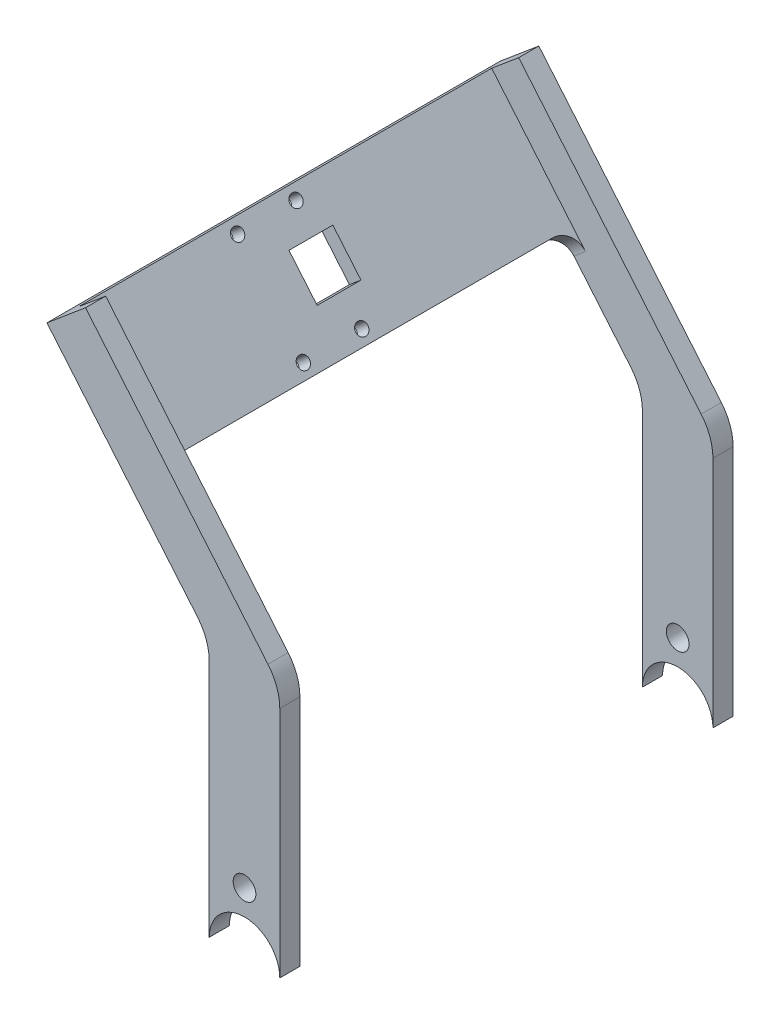
ISO-10303-21;
HEADER;
FILE_DESCRIPTION(('STEP AP214'),'2;1');
FILE_NAME('part.step','',(''),(''),'','','');
FILE_SCHEMA(('AUTOMOTIVE_DESIGN { 1 0 10303 214 1 1 1 1 }'));
ENDSEC;
DATA;
#1=APPLICATION_CONTEXT('core data for automotive mechanical design processes');
#2=APPLICATION_PROTOCOL_DEFINITION('international standard','automotive_design',2000,#1);
#3=PRODUCT_CONTEXT('',#1,'mechanical');
#4=PRODUCT('Part','Part','',(#3));
#5=PRODUCT_RELATED_PRODUCT_CATEGORY('part','',(#4));
#6=PRODUCT_DEFINITION_FORMATION('','',#4);
#7=PRODUCT_DEFINITION_CONTEXT('part definition',#1,'design');
#8=PRODUCT_DEFINITION('design','',#6,#7);
#9=PRODUCT_DEFINITION_SHAPE('','',#8);
#10=(LENGTH_UNIT() NAMED_UNIT(*) SI_UNIT(.MILLI.,.METRE.));
#11=(NAMED_UNIT(*) PLANE_ANGLE_UNIT() SI_UNIT($,.RADIAN.));
#12=(NAMED_UNIT(*) SI_UNIT($,.STERADIAN.) SOLID_ANGLE_UNIT());
#13=UNCERTAINTY_MEASURE_WITH_UNIT(LENGTH_MEASURE(1.E-05),#10,'distance_accuracy_value','');
#14=(GEOMETRIC_REPRESENTATION_CONTEXT(3) GLOBAL_UNCERTAINTY_ASSIGNED_CONTEXT((#13)) GLOBAL_UNIT_ASSIGNED_CONTEXT((#10,
#11,#12)) REPRESENTATION_CONTEXT('',''));
#15=CARTESIAN_POINT('',(0.,0.,0.));
#16=DIRECTION('',(0.,0.,1.));
#17=DIRECTION('',(1.,0.,0.));
#18=AXIS2_PLACEMENT_3D('',#15,#16,#17);
#19=CARTESIAN_POINT('',(7.00000000000001,50.,4.));
#20=DIRECTION('',(-1.,0.,0.));
#21=DIRECTION('',(0.,-1.,0.));
#22=AXIS2_PLACEMENT_3D('',#19,#20,#21);
#23=PLANE('',#22);
#24=DIRECTION('',(0.,1.,0.));
#25=VECTOR('',#24,1.);
#26=CARTESIAN_POINT('',(7.00000000000001,50.,0.));
#27=LINE('',#26,#25);
#28=CARTESIAN_POINT('',(6.99999999999999,0.,0.));
#29=VERTEX_POINT('',#28);
#30=CARTESIAN_POINT('',(7.00000000000001,46.360297657338,0.));
#31=VERTEX_POINT('',#30);
#32=EDGE_CURVE('E318',#29,#31,#27,.T.);
#33=ORIENTED_EDGE('',*,*,#32,.T.);
#34=DIRECTION('',(0.,0.,-1.));
#35=VECTOR('',#34,1.);
#36=CARTESIAN_POINT('',(7.00000000000001,46.360297657338,4.));
#37=LINE('',#36,#35);
#38=CARTESIAN_POINT('',(7.00000000000001,46.360297657338,4.));
#39=VERTEX_POINT('',#38);
#40=EDGE_CURVE('E379',#31,#39,#37,.F.);
#41=ORIENTED_EDGE('',*,*,#40,.T.);
#42=DIRECTION('',(0.,1.,0.));
#43=VECTOR('',#42,1.);
#44=CARTESIAN_POINT('',(7.00000000000001,50.,4.));
#45=LINE('',#44,#43);
#46=CARTESIAN_POINT('',(6.99999999999999,0.,4.));
#47=VERTEX_POINT('',#46);
#48=EDGE_CURVE('E323',#47,#39,#45,.T.);
#49=ORIENTED_EDGE('',*,*,#48,.F.);
#50=DIRECTION('',(0.,0.,-1.));
#51=VECTOR('',#50,1.);
#52=CARTESIAN_POINT('',(6.99999999999999,0.,4.));
#53=LINE('',#52,#51);
#54=EDGE_CURVE('E338',#47,#29,#53,.T.);
#55=ORIENTED_EDGE('',*,*,#54,.T.);
#56=EDGE_LOOP('',(#33,#41,#49,#55));
#57=FACE_BOUND('',#56,.T.);
#58=ADVANCED_FACE('F37',(#57),#23,.F.);
#59=CARTESIAN_POINT('',(-31.5672565811925,95.9626665871386,4.));
#60=DIRECTION('',(-0.766044443118976,-0.642787609686541,0.));
#61=DIRECTION('',(0.642787609686541,-0.766044443118976,0.));
#62=AXIS2_PLACEMENT_3D('',#59,#60,#61);
#63=PLANE('',#62);
#64=DIRECTION('',(-0.642787609686541,0.766044443118976,0.));
#65=VECTOR('',#64,1.);
#66=CARTESIAN_POINT('',(-31.5672565811925,95.9626665871386,4.));
#67=LINE('',#66,#65);
#68=CARTESIAN_POINT('',(4.66044443118977,52.7881737542034,4.));
#69=VERTEX_POINT('',#68);
#70=CARTESIAN_POINT('',(-31.5672565811925,95.9626665871386,4.));
#71=VERTEX_POINT('',#70);
#72=EDGE_CURVE('E326',#69,#71,#67,.T.);
#73=ORIENTED_EDGE('',*,*,#72,.F.);
#74=DIRECTION('',(0.,0.,-1.));
#75=VECTOR('',#74,1.);
#76=CARTESIAN_POINT('',(4.66044443118978,52.7881737542034,4.));
#77=LINE('',#76,#75);
#78=CARTESIAN_POINT('',(4.66044443118977,52.7881737542034,0.));
#79=VERTEX_POINT('',#78);
#80=EDGE_CURVE('E374',#69,#79,#77,.T.);
#81=ORIENTED_EDGE('',*,*,#80,.T.);
#82=DIRECTION('',(-0.642787609686541,0.766044443118976,0.));
#83=VECTOR('',#82,1.);
#84=CARTESIAN_POINT('',(-31.5672565811925,95.9626665871386,0.));
#85=LINE('',#84,#83);
#86=CARTESIAN_POINT('',(-31.5672565811925,95.9626665871386,0.));
#87=VERTEX_POINT('',#86);
#88=EDGE_CURVE('E341',#79,#87,#85,.T.);
#89=ORIENTED_EDGE('',*,*,#88,.T.);
#90=DIRECTION('',(0.,0.,-1.));
#91=VECTOR('',#90,1.);
#92=CARTESIAN_POINT('',(-31.5672565811925,95.9626665871386,4.));
#93=LINE('',#92,#91);
#94=EDGE_CURVE('E359',#71,#87,#93,.T.);
#95=ORIENTED_EDGE('',*,*,#94,.F.);
#96=EDGE_LOOP('',(#73,#81,#89,#95));
#97=FACE_BOUND('',#96,.T.);
#98=ADVANCED_FACE('F486',(#97),#63,.F.);
#99=CARTESIAN_POINT('',(-39.2277010123822,89.5347904902732,4.));
#100=DIRECTION('',(0.642787609686541,-0.766044443118976,0.));
#101=DIRECTION('',(0.766044443118976,0.642787609686541,0.));
#102=AXIS2_PLACEMENT_3D('',#99,#100,#101);
#103=PLANE('',#102);
#104=DIRECTION('',(-0.766044443118976,-0.642787609686541,0.));
#105=VECTOR('',#104,1.);
#106=CARTESIAN_POINT('',(-39.2277010123822,89.5347904902732,0.));
#107=LINE('',#106,#105);
#108=CARTESIAN_POINT('',(-36.9295676830253,91.4631533193328,0.));
#109=VERTEX_POINT('',#108);
#110=EDGE_CURVE('E343',#87,#109,#107,.T.);
#111=ORIENTED_EDGE('',*,*,#110,.T.);
#112=DIRECTION('',(0.,0.,1.));
#113=VECTOR('',#112,1.);
#114=CARTESIAN_POINT('',(-36.9295676830253,91.4631533193328,-82.));
#115=LINE('',#114,#113);
#116=CARTESIAN_POINT('',(-36.9295676830253,91.4631533193328,-82.));
#117=VERTEX_POINT('',#116);
#118=EDGE_CURVE('E312',#117,#109,#115,.T.);
#119=ORIENTED_EDGE('',*,*,#118,.F.);
#120=DIRECTION('',(0.766044443118976,0.642787609686541,0.));
#121=VECTOR('',#120,1.);
#122=CARTESIAN_POINT('',(-31.5672565811925,95.9626665871386,-82.));
#123=LINE('',#122,#121);
#124=CARTESIAN_POINT('',(-31.5672565811925,95.9626665871386,-82.));
#125=VERTEX_POINT('',#124);
#126=EDGE_CURVE('E296',#117,#125,#123,.T.);
#127=ORIENTED_EDGE('',*,*,#126,.T.);
#128=DIRECTION('',(0.,0.,1.));
#129=VECTOR('',#128,1.);
#130=CARTESIAN_POINT('',(-31.5672565811925,95.9626665871386,-86.));
#131=LINE('',#130,#129);
#132=CARTESIAN_POINT('',(-31.5672565811925,95.9626665871386,-86.));
#133=VERTEX_POINT('',#132);
#134=EDGE_CURVE('E304',#133,#125,#131,.T.);
#135=ORIENTED_EDGE('',*,*,#134,.F.);
#136=DIRECTION('',(0.766044443118976,0.642787609686541,0.));
#137=VECTOR('',#136,1.);
#138=CARTESIAN_POINT('',(-31.5672565811925,95.9626665871386,-86.));
#139=LINE('',#138,#137);
#140=CARTESIAN_POINT('',(-39.2277010123822,89.5347904902732,-86.));
#141=VERTEX_POINT('',#140);
#142=EDGE_CURVE('E281',#141,#133,#139,.T.);
#143=ORIENTED_EDGE('',*,*,#142,.F.);
#144=DIRECTION('',(0.,0.,-1.));
#145=VECTOR('',#144,1.);
#146=CARTESIAN_POINT('',(-39.2277010123822,89.5347904902732,4.));
#147=LINE('',#146,#145);
#148=CARTESIAN_POINT('',(-39.2277010123822,89.5347904902732,4.));
#149=VERTEX_POINT('',#148);
#150=EDGE_CURVE('E356',#149,#141,#147,.T.);
#151=ORIENTED_EDGE('',*,*,#150,.F.);
#152=DIRECTION('',(-0.766044443118976,-0.642787609686541,0.));
#153=VECTOR('',#152,1.);
#154=CARTESIAN_POINT('',(-39.2277010123822,89.5347904902732,4.));
#155=LINE('',#154,#153);
#156=EDGE_CURVE('E329',#71,#149,#155,.T.);
#157=ORIENTED_EDGE('',*,*,#156,.F.);
#158=ORIENTED_EDGE('',*,*,#94,.T.);
#159=EDGE_LOOP('',(#111,#119,#127,#135,#143,#151,#157,#158));
#160=FACE_BOUND('',#159,.T.);
#161=ADVANCED_FACE('F449',(#160),#103,.F.);
#162=CARTESIAN_POINT('',(-7.00000000000001,51.1273120277148,4.));
#163=DIRECTION('',(0.766044443118977,0.642787609686541,0.));
#164=DIRECTION('',(-0.642787609686541,0.766044443118977,0.));
#165=AXIS2_PLACEMENT_3D('',#162,#163,#164);
#166=PLANE('',#165);
#167=CARTESIAN_POINT('',(-37.7171501296189,87.7345860489436,-41.65));
#168=DIRECTION('',(0.766044443118977,0.642787609686541,0.));
#169=DIRECTION('',(-0.642787609686541,0.766044443118977,0.));
#170=AXIS2_PLACEMENT_3D('',#167,#168,#169);
#171=CIRCLE('',#170,1.2);
#172=CARTESIAN_POINT('',(-38.4884952612427,88.6538393806864,-41.65));
#173=VERTEX_POINT('',#172);
#174=EDGE_CURVE('E258',#173,#173,#171,.T.);
#175=ORIENTED_EDGE('',*,*,#174,.T.);
#176=EDGE_LOOP('',(#175));
#177=FACE_BOUND('',#176,.T.);
#178=CARTESIAN_POINT('',(-24.6685616529821,72.1838838536284,-30.05));
#179=DIRECTION('',(0.766044443118977,0.642787609686541,0.));
#180=DIRECTION('',(-0.642787609686541,0.766044443118977,0.));
#181=AXIS2_PLACEMENT_3D('',#178,#179,#180);
#182=CIRCLE('',#181,1.2);
#183=CARTESIAN_POINT('',(-25.4399067846059,73.1031371853712,-30.05));
#184=VERTEX_POINT('',#183);
#185=EDGE_CURVE('E255',#184,#184,#182,.T.);
#186=ORIENTED_EDGE('',*,*,#185,.T.);
#187=EDGE_LOOP('',(#186));
#188=FACE_BOUND('',#187,.T.);
#189=DIRECTION('',(0.,0.,1.));
#190=VECTOR('',#189,1.);
#191=CARTESIAN_POINT('',(-34.1175395153742,83.4447371674773,4.00000000000007));
#192=LINE('',#191,#190);
#193=CARTESIAN_POINT('',(-34.1175395153743,83.4447371674774,-45.35));
#194=VERTEX_POINT('',#193);
#195=CARTESIAN_POINT('',(-34.1175395153743,83.4447371674773,-36.65));
#196=VERTEX_POINT('',#195);
#197=EDGE_CURVE('E252',#194,#196,#192,.T.);
#198=ORIENTED_EDGE('',*,*,#197,.T.);
#199=DIRECTION('',(0.642787609686541,-0.766044443118977,0.));
#200=VECTOR('',#199,1.);
#201=CARTESIAN_POINT('',(-7.00000000000001,51.1273120277148,-36.65));
#202=LINE('',#201,#200);
#203=CARTESIAN_POINT('',(-28.5252873111013,76.7801505123422,-36.65));
#204=VERTEX_POINT('',#203);
#205=EDGE_CURVE('E204',#196,#204,#202,.T.);
#206=ORIENTED_EDGE('',*,*,#205,.T.);
#207=DIRECTION('',(0.,0.,-1.));
#208=VECTOR('',#207,1.);
#209=CARTESIAN_POINT('',(-28.5252873111013,76.7801505123422,4.00000000000006));
#210=LINE('',#209,#208);
#211=CARTESIAN_POINT('',(-28.5252873111013,76.7801505123422,-45.35));
#212=VERTEX_POINT('',#211);
#213=EDGE_CURVE('E246',#204,#212,#210,.T.);
#214=ORIENTED_EDGE('',*,*,#213,.T.);
#215=DIRECTION('',(-0.642787609686541,0.766044443118977,0.));
#216=VECTOR('',#215,1.);
#217=CARTESIAN_POINT('',(-6.99999999999999,51.1273120277148,-45.35));
#218=LINE('',#217,#216);
#219=EDGE_CURVE('E249',#212,#194,#218,.T.);
#220=ORIENTED_EDGE('',*,*,#219,.T.);
#221=EDGE_LOOP('',(#198,#206,#214,#220));
#222=FACE_BOUND('',#221,.T.);
#223=CARTESIAN_POINT('',(-24.6685616529821,72.1838838536284,-41.65));
#224=DIRECTION('',(0.766044443118977,0.642787609686541,0.));
#225=DIRECTION('',(-0.642787609686541,0.766044443118977,0.));
#226=AXIS2_PLACEMENT_3D('',#223,#224,#225);
#227=CIRCLE('',#226,1.2);
#228=CARTESIAN_POINT('',(-25.4399067846059,73.1031371853711,-41.65));
#229=VERTEX_POINT('',#228);
#230=EDGE_CURVE('E243',#229,#229,#227,.T.);
#231=ORIENTED_EDGE('',*,*,#230,.T.);
#232=EDGE_LOOP('',(#231));
#233=FACE_BOUND('',#232,.T.);
#234=CARTESIAN_POINT('',(-37.7171501296189,87.7345860489436,-30.05));
#235=DIRECTION('',(0.766044443118977,0.642787609686541,0.));
#236=DIRECTION('',(-0.642787609686541,0.766044443118977,0.));
#237=AXIS2_PLACEMENT_3D('',#234,#235,#236);
#238=CIRCLE('',#237,1.2);
#239=CARTESIAN_POINT('',(-38.4884952612427,88.6538393806864,-30.05));
#240=VERTEX_POINT('',#239);
#241=EDGE_CURVE('E240',#240,#240,#238,.T.);
#242=ORIENTED_EDGE('',*,*,#241,.T.);
#243=EDGE_LOOP('',(#242));
#244=FACE_BOUND('',#243,.T.);
#245=DIRECTION('',(0.,0.,1.));
#246=VECTOR('',#245,1.);
#247=CARTESIAN_POINT('',(-23.1580107702187,70.3836794122988,-82.));
#248=LINE('',#247,#246);
#249=CARTESIAN_POINT('',(-23.1580107702187,70.3836794122988,-78.));
#250=VERTEX_POINT('',#249);
#251=CARTESIAN_POINT('',(-23.1580107702187,70.3836794122988,-4.));
#252=VERTEX_POINT('',#251);
#253=EDGE_CURVE('E319',#250,#252,#248,.T.);
#254=ORIENTED_EDGE('',*,*,#253,.T.);
#255=CARTESIAN_POINT('',(-20.5868603314725,67.3195016398229,-4.));
#256=DIRECTION('',(0.766044443118977,0.642787609686541,0.));
#257=DIRECTION('',(-0.642787609686541,0.766044443118977,0.));
#258=AXIS2_PLACEMENT_3D('',#255,#256,#257);
#259=CIRCLE('',#258,4.);
#260=CARTESIAN_POINT('',(-20.5868603314725,67.3195016398229,0.));
#261=VERTEX_POINT('',#260);
#262=EDGE_CURVE('E412',#252,#261,#259,.T.);
#263=ORIENTED_EDGE('',*,*,#262,.T.);
#264=DIRECTION('',(0.642787609686541,-0.766044443118976,0.));
#265=VECTOR('',#264,1.);
#266=CARTESIAN_POINT('',(-7.00000000000001,51.1273120277148,0.));
#267=LINE('',#266,#265);
#268=CARTESIAN_POINT('',(-9.33955556881025,53.9154857819182,0.));
#269=VERTEX_POINT('',#268);
#270=EDGE_CURVE('E346',#261,#269,#267,.T.);
#271=ORIENTED_EDGE('',*,*,#270,.T.);
#272=DIRECTION('',(0.,0.,-1.));
#273=VECTOR('',#272,1.);
#274=CARTESIAN_POINT('',(-9.33955556881025,53.9154857819182,4.));
#275=LINE('',#274,#273);
#276=CARTESIAN_POINT('',(-9.33955556881025,53.9154857819182,4.));
#277=VERTEX_POINT('',#276);
#278=EDGE_CURVE('E370',#269,#277,#275,.F.);
#279=ORIENTED_EDGE('',*,*,#278,.T.);
#280=DIRECTION('',(0.642787609686541,-0.766044443118976,0.));
#281=VECTOR('',#280,1.);
#282=CARTESIAN_POINT('',(-7.00000000000001,51.1273120277148,4.));
#283=LINE('',#282,#281);
#284=EDGE_CURVE('E331',#149,#277,#283,.T.);
#285=ORIENTED_EDGE('',*,*,#284,.F.);
#286=ORIENTED_EDGE('',*,*,#150,.T.);
#287=DIRECTION('',(-0.642787609686541,0.766044443118976,0.));
#288=VECTOR('',#287,1.);
#289=CARTESIAN_POINT('',(-39.2277010123822,89.5347904902732,-86.));
#290=LINE('',#289,#288);
#291=CARTESIAN_POINT('',(-9.33955556881026,53.9154857819182,-86.));
#292=VERTEX_POINT('',#291);
#293=EDGE_CURVE('E279',#292,#141,#290,.T.);
#294=ORIENTED_EDGE('',*,*,#293,.F.);
#295=DIRECTION('',(0.,0.,1.));
#296=VECTOR('',#295,1.);
#297=CARTESIAN_POINT('',(-9.33955556881025,53.9154857819182,-82.));
#298=LINE('',#297,#296);
#299=CARTESIAN_POINT('',(-9.33955556881026,53.9154857819182,-82.));
#300=VERTEX_POINT('',#299);
#301=EDGE_CURVE('E367',#292,#300,#298,.T.);
#302=ORIENTED_EDGE('',*,*,#301,.T.);
#303=DIRECTION('',(-0.642787609686541,0.766044443118976,0.));
#304=VECTOR('',#303,1.);
#305=CARTESIAN_POINT('',(-39.2277010123822,89.5347904902732,-82.));
#306=LINE('',#305,#304);
#307=CARTESIAN_POINT('',(-20.5868603314726,67.3195016398229,-82.));
#308=VERTEX_POINT('',#307);
#309=EDGE_CURVE('E294',#300,#308,#306,.T.);
#310=ORIENTED_EDGE('',*,*,#309,.T.);
#311=CARTESIAN_POINT('',(-20.5868603314726,67.3195016398229,-78.));
#312=DIRECTION('',(0.766044443118977,0.642787609686541,0.));
#313=DIRECTION('',(-0.642787609686541,0.766044443118977,0.));
#314=AXIS2_PLACEMENT_3D('',#311,#312,#313);
#315=CIRCLE('',#314,4.);
#316=EDGE_CURVE('E11',#308,#250,#315,.T.);
#317=ORIENTED_EDGE('',*,*,#316,.T.);
#318=EDGE_LOOP('',(#254,#263,#271,#279,#285,#286,#294,#302,#310,#317));
#319=FACE_BOUND('',#318,.T.);
#320=ADVANCED_FACE('F420',(#177,#188,#222,#233,#244,#319),#166,.F.);
#321=CARTESIAN_POINT('',(-7.,0.,4.));
#322=DIRECTION('',(1.,0.,0.));
#323=DIRECTION('',(0.,1.,0.));
#324=AXIS2_PLACEMENT_3D('',#321,#322,#323);
#325=PLANE('',#324);
#326=DIRECTION('',(0.,-1.,0.));
#327=VECTOR('',#326,1.);
#328=CARTESIAN_POINT('',(-7.,0.,4.));
#329=LINE('',#328,#327);
#330=CARTESIAN_POINT('',(-7.00000000000001,47.4876096850527,4.));
#331=VERTEX_POINT('',#330);
#332=CARTESIAN_POINT('',(-7.,0.,4.));
#333=VERTEX_POINT('',#332);
#334=EDGE_CURVE('E334',#331,#333,#329,.T.);
#335=ORIENTED_EDGE('',*,*,#334,.F.);
#336=DIRECTION('',(0.,0.,-1.));
#337=VECTOR('',#336,1.);
#338=CARTESIAN_POINT('',(-7.00000000000001,47.4876096850528,0.));
#339=LINE('',#338,#337);
#340=CARTESIAN_POINT('',(-7.00000000000001,47.4876096850527,0.));
#341=VERTEX_POINT('',#340);
#342=EDGE_CURVE('E362',#331,#341,#339,.T.);
#343=ORIENTED_EDGE('',*,*,#342,.T.);
#344=DIRECTION('',(0.,-1.,0.));
#345=VECTOR('',#344,1.);
#346=CARTESIAN_POINT('',(-7.,0.,0.));
#347=LINE('',#346,#345);
#348=CARTESIAN_POINT('',(-7.,0.,0.));
#349=VERTEX_POINT('',#348);
#350=EDGE_CURVE('E348',#341,#349,#347,.T.);
#351=ORIENTED_EDGE('',*,*,#350,.T.);
#352=DIRECTION('',(0.,0.,-1.));
#353=VECTOR('',#352,1.);
#354=CARTESIAN_POINT('',(-7.,0.,4.));
#355=LINE('',#354,#353);
#356=EDGE_CURVE('E353',#333,#349,#355,.T.);
#357=ORIENTED_EDGE('',*,*,#356,.F.);
#358=EDGE_LOOP('',(#335,#343,#351,#357));
#359=FACE_BOUND('',#358,.T.);
#360=ADVANCED_FACE('F500',(#359),#325,.F.);
#361=CARTESIAN_POINT('',(0.,0.,4.));
#362=DIRECTION('',(0.,0.,-1.));
#363=DIRECTION('',(-1.,0.,0.));
#364=AXIS2_PLACEMENT_3D('',#361,#362,#363);
#365=CYLINDRICAL_SURFACE('',#364,7.);
#366=CARTESIAN_POINT('',(0.,0.,0.));
#367=DIRECTION('',(0.,0.,-1.));
#368=DIRECTION('',(1.,0.,0.));
#369=AXIS2_PLACEMENT_3D('',#366,#367,#368);
#370=CIRCLE('',#369,7.);
#371=EDGE_CURVE('E327',#349,#29,#370,.T.);
#372=ORIENTED_EDGE('',*,*,#371,.T.);
#373=ORIENTED_EDGE('',*,*,#54,.F.);
#374=CARTESIAN_POINT('',(0.,0.,4.));
#375=DIRECTION('',(0.,0.,-1.));
#376=DIRECTION('',(1.,0.,0.));
#377=AXIS2_PLACEMENT_3D('',#374,#375,#376);
#378=CIRCLE('',#377,7.);
#379=EDGE_CURVE('E336',#333,#47,#378,.T.);
#380=ORIENTED_EDGE('',*,*,#379,.F.);
#381=ORIENTED_EDGE('',*,*,#356,.T.);
#382=EDGE_LOOP('',(#372,#373,#380,#381));
#383=FACE_BOUND('',#382,.T.);
#384=ADVANCED_FACE('F498',(#383),#365,.F.);
#385=CARTESIAN_POINT('',(0.,0.,4.));
#386=DIRECTION('',(0.,0.,1.));
#387=DIRECTION('',(1.,0.,0.));
#388=AXIS2_PLACEMENT_3D('',#385,#386,#387);
#389=PLANE('',#388);
#390=CARTESIAN_POINT('',(0.,12.,4.));
#391=DIRECTION('',(0.,0.,1.));
#392=DIRECTION('',(1.,0.,0.));
#393=AXIS2_PLACEMENT_3D('',#390,#391,#392);
#394=CIRCLE('',#393,2.24999999999999);
#395=CARTESIAN_POINT('',(2.24999999999998,12.,4.));
#396=VERTEX_POINT('',#395);
#397=EDGE_CURVE('E261',#396,#396,#394,.T.);
#398=ORIENTED_EDGE('',*,*,#397,.F.);
#399=EDGE_LOOP('',(#398));
#400=FACE_BOUND('',#399,.T.);
#401=ORIENTED_EDGE('',*,*,#48,.T.);
#402=CARTESIAN_POINT('',(-3.,46.360297657338,4.));
#403=DIRECTION('',(0.,0.,1.));
#404=DIRECTION('',(1.,0.,0.));
#405=AXIS2_PLACEMENT_3D('',#402,#403,#404);
#406=CIRCLE('',#405,10.);
#407=EDGE_CURVE('E381',#39,#69,#406,.T.);
#408=ORIENTED_EDGE('',*,*,#407,.T.);
#409=ORIENTED_EDGE('',*,*,#72,.T.);
#410=ORIENTED_EDGE('',*,*,#156,.T.);
#411=ORIENTED_EDGE('',*,*,#284,.T.);
#412=CARTESIAN_POINT('',(-17.,47.4876096850528,4.));
#413=DIRECTION('',(0.,0.,1.));
#414=DIRECTION('',(1.,0.,0.));
#415=AXIS2_PLACEMENT_3D('',#412,#413,#414);
#416=CIRCLE('',#415,10.);
#417=EDGE_CURVE('E395',#277,#331,#416,.F.);
#418=ORIENTED_EDGE('',*,*,#417,.T.);
#419=ORIENTED_EDGE('',*,*,#334,.T.);
#420=ORIENTED_EDGE('',*,*,#379,.T.);
#421=EDGE_LOOP('',(#401,#408,#409,#410,#411,#418,#419,#420));
#422=FACE_BOUND('',#421,.T.);
#423=ADVANCED_FACE('F441',(#400,#422),#389,.T.);
#424=CARTESIAN_POINT('',(0.,0.,0.));
#425=DIRECTION('',(0.,0.,1.));
#426=DIRECTION('',(1.,0.,0.));
#427=AXIS2_PLACEMENT_3D('',#424,#425,#426);
#428=PLANE('',#427);
#429=CARTESIAN_POINT('',(0.,12.,0.));
#430=DIRECTION('',(0.,0.,1.));
#431=DIRECTION('',(1.,0.,0.));
#432=AXIS2_PLACEMENT_3D('',#429,#430,#431);
#433=CIRCLE('',#432,2.24999999999998);
#434=CARTESIAN_POINT('',(2.24999999999996,12.,0.));
#435=VERTEX_POINT('',#434);
#436=EDGE_CURVE('E268',#435,#435,#433,.T.);
#437=ORIENTED_EDGE('',*,*,#436,.T.);
#438=EDGE_LOOP('',(#437));
#439=FACE_BOUND('',#438,.T.);
#440=ORIENTED_EDGE('',*,*,#270,.F.);
#441=DIRECTION('',(0.766044443118979,0.642787609686538,0.));
#442=VECTOR('',#441,1.);
#443=CARTESIAN_POINT('',(-41.6543783474221,49.6417550428189,0.));
#444=LINE('',#443,#442);
#445=CARTESIAN_POINT('',(-18.2887270021156,69.2478644688825,0.));
#446=VERTEX_POINT('',#445);
#447=EDGE_CURVE('E401',#261,#446,#444,.T.);
#448=ORIENTED_EDGE('',*,*,#447,.T.);
#449=DIRECTION('',(-0.642787609686542,0.766044443118976,0.));
#450=VECTOR('',#449,1.);
#451=CARTESIAN_POINT('',(-20.8598774408618,72.3120422413584,0.));
#452=LINE('',#451,#450);
#453=EDGE_CURVE('E310',#446,#109,#452,.T.);
#454=ORIENTED_EDGE('',*,*,#453,.T.);
#455=ORIENTED_EDGE('',*,*,#110,.F.);
#456=ORIENTED_EDGE('',*,*,#88,.F.);
#457=CARTESIAN_POINT('',(-3.,46.360297657338,0.));
#458=DIRECTION('',(0.,0.,1.));
#459=DIRECTION('',(1.,0.,0.));
#460=AXIS2_PLACEMENT_3D('',#457,#458,#459);
#461=CIRCLE('',#460,10.);
#462=EDGE_CURVE('E377',#79,#31,#461,.F.);
#463=ORIENTED_EDGE('',*,*,#462,.T.);
#464=ORIENTED_EDGE('',*,*,#32,.F.);
#465=ORIENTED_EDGE('',*,*,#371,.F.);
#466=ORIENTED_EDGE('',*,*,#350,.F.);
#467=CARTESIAN_POINT('',(-17.,47.4876096850528,0.));
#468=DIRECTION('',(0.,0.,1.));
#469=DIRECTION('',(1.,0.,0.));
#470=AXIS2_PLACEMENT_3D('',#467,#468,#469);
#471=CIRCLE('',#470,10.);
#472=EDGE_CURVE('E392',#341,#269,#471,.T.);
#473=ORIENTED_EDGE('',*,*,#472,.T.);
#474=EDGE_LOOP('',(#440,#448,#454,#455,#456,#463,#464,#465,#466,#473));
#475=FACE_BOUND('',#474,.T.);
#476=ADVANCED_FACE('F431',(#439,#475),#428,.F.);
#477=CARTESIAN_POINT('',(-20.8598774408618,72.3120422413584,-82.));
#478=DIRECTION('',(0.766044443118976,0.642787609686542,0.));
#479=DIRECTION('',(-0.642787609686542,0.766044443118976,0.));
#480=AXIS2_PLACEMENT_3D('',#477,#478,#479);
#481=PLANE('',#480);
#482=CARTESIAN_POINT('',(-35.4190168002619,89.6629488780032,-41.65));
#483=DIRECTION('',(0.766044443118976,0.642787609686542,0.));
#484=DIRECTION('',(-0.642787609686542,0.766044443118976,0.));
#485=AXIS2_PLACEMENT_3D('',#482,#483,#484);
#486=CIRCLE('',#485,1.2);
#487=CARTESIAN_POINT('',(-36.1903619318858,90.582202209746,-41.65));
#488=VERTEX_POINT('',#487);
#489=EDGE_CURVE('E232',#488,#488,#486,.T.);
#490=ORIENTED_EDGE('',*,*,#489,.F.);
#491=EDGE_LOOP('',(#490));
#492=FACE_BOUND('',#491,.T.);
#493=CARTESIAN_POINT('',(-22.3704283236251,74.112246682688,-30.05));
#494=DIRECTION('',(0.766044443118976,0.642787609686542,0.));
#495=DIRECTION('',(-0.642787609686542,0.766044443118976,0.));
#496=AXIS2_PLACEMENT_3D('',#493,#494,#495);
#497=CIRCLE('',#496,1.2);
#498=CARTESIAN_POINT('',(-23.141773455249,75.0315000144308,-30.05));
#499=VERTEX_POINT('',#498);
#500=EDGE_CURVE('E227',#499,#499,#497,.T.);
#501=ORIENTED_EDGE('',*,*,#500,.F.);
#502=EDGE_LOOP('',(#501));
#503=FACE_BOUND('',#502,.T.);
#504=DIRECTION('',(0.642787609686542,-0.766044443118976,0.));
#505=VECTOR('',#504,1.);
#506=CARTESIAN_POINT('',(-31.8194061860173,85.373099996537,-36.65));
#507=LINE('',#506,#505);
#508=CARTESIAN_POINT('',(-31.8194061860173,85.373099996537,-36.65));
#509=VERTEX_POINT('',#508);
#510=CARTESIAN_POINT('',(-26.2271539817444,78.7085133414019,-36.65));
#511=VERTEX_POINT('',#510);
#512=EDGE_CURVE('E201',#509,#511,#507,.T.);
#513=ORIENTED_EDGE('',*,*,#512,.F.);
#514=DIRECTION('',(0.,0.,1.));
#515=VECTOR('',#514,1.);
#516=CARTESIAN_POINT('',(-31.8194061860173,85.373099996537,-36.65));
#517=LINE('',#516,#515);
#518=CARTESIAN_POINT('',(-31.8194061860173,85.373099996537,-45.35));
#519=VERTEX_POINT('',#518);
#520=EDGE_CURVE('E210',#519,#509,#517,.T.);
#521=ORIENTED_EDGE('',*,*,#520,.F.);
#522=DIRECTION('',(-0.642787609686542,0.766044443118976,0.));
#523=VECTOR('',#522,1.);
#524=CARTESIAN_POINT('',(-31.8194061860173,85.373099996537,-45.35));
#525=LINE('',#524,#523);
#526=CARTESIAN_POINT('',(-26.2271539817444,78.7085133414019,-45.35));
#527=VERTEX_POINT('',#526);
#528=EDGE_CURVE('E216',#527,#519,#525,.T.);
#529=ORIENTED_EDGE('',*,*,#528,.F.);
#530=DIRECTION('',(0.,0.,-1.));
#531=VECTOR('',#530,1.);
#532=CARTESIAN_POINT('',(-26.2271539817444,78.7085133414019,-36.65));
#533=LINE('',#532,#531);
#534=EDGE_CURVE('E223',#511,#527,#533,.T.);
#535=ORIENTED_EDGE('',*,*,#534,.F.);
#536=EDGE_LOOP('',(#513,#521,#529,#535));
#537=FACE_BOUND('',#536,.T.);
#538=CARTESIAN_POINT('',(-22.3704283236251,74.112246682688,-41.65));
#539=DIRECTION('',(0.766044443118976,0.642787609686542,0.));
#540=DIRECTION('',(-0.642787609686542,0.766044443118976,0.));
#541=AXIS2_PLACEMENT_3D('',#538,#539,#540);
#542=CIRCLE('',#541,1.2);
#543=CARTESIAN_POINT('',(-23.141773455249,75.0315000144308,-41.65));
#544=VERTEX_POINT('',#543);
#545=EDGE_CURVE('E224',#544,#544,#542,.T.);
#546=ORIENTED_EDGE('',*,*,#545,.F.);
#547=EDGE_LOOP('',(#546));
#548=FACE_BOUND('',#547,.T.);
#549=CARTESIAN_POINT('',(-35.4190168002619,89.6629488780032,-30.05));
#550=DIRECTION('',(0.766044443118976,0.642787609686542,0.));
#551=DIRECTION('',(-0.642787609686542,0.766044443118976,0.));
#552=AXIS2_PLACEMENT_3D('',#549,#550,#551);
#553=CIRCLE('',#552,1.2);
#554=CARTESIAN_POINT('',(-36.1903619318858,90.582202209746,-30.05));
#555=VERTEX_POINT('',#554);
#556=EDGE_CURVE('E235',#555,#555,#553,.T.);
#557=ORIENTED_EDGE('',*,*,#556,.F.);
#558=EDGE_LOOP('',(#557));
#559=FACE_BOUND('',#558,.T.);
#560=ORIENTED_EDGE('',*,*,#453,.F.);
#561=CARTESIAN_POINT('',(-18.2887270021156,69.2478644688825,-4.));
#562=DIRECTION('',(0.766044443118976,0.642787609686542,0.));
#563=DIRECTION('',(-0.642787609686542,0.766044443118976,0.));
#564=AXIS2_PLACEMENT_3D('',#561,#562,#563);
#565=CIRCLE('',#564,4.);
#566=CARTESIAN_POINT('',(-20.8598774408618,72.3120422413584,-4.));
#567=VERTEX_POINT('',#566);
#568=EDGE_CURVE('E410',#446,#567,#565,.F.);
#569=ORIENTED_EDGE('',*,*,#568,.T.);
#570=DIRECTION('',(0.,0.,1.));
#571=VECTOR('',#570,1.);
#572=CARTESIAN_POINT('',(-20.8598774408618,72.3120422413584,-82.));
#573=LINE('',#572,#571);
#574=CARTESIAN_POINT('',(-20.8598774408618,72.3120422413584,-78.));
#575=VERTEX_POINT('',#574);
#576=EDGE_CURVE('E315',#575,#567,#573,.T.);
#577=ORIENTED_EDGE('',*,*,#576,.F.);
#578=CARTESIAN_POINT('',(-18.2887270021156,69.2478644688825,-78.));
#579=DIRECTION('',(0.766044443118976,0.642787609686542,0.));
#580=DIRECTION('',(-0.642787609686542,0.766044443118976,0.));
#581=AXIS2_PLACEMENT_3D('',#578,#579,#580);
#582=CIRCLE('',#581,4.);
#583=CARTESIAN_POINT('',(-18.2887270021156,69.2478644688825,-82.));
#584=VERTEX_POINT('',#583);
#585=EDGE_CURVE('E45',#575,#584,#582,.F.);
#586=ORIENTED_EDGE('',*,*,#585,.T.);
#587=DIRECTION('',(-0.642787609686542,0.766044443118976,0.));
#588=VECTOR('',#587,1.);
#589=CARTESIAN_POINT('',(-20.8598774408618,72.3120422413584,-82.));
#590=LINE('',#589,#588);
#591=EDGE_CURVE('E52',#584,#117,#590,.T.);
#592=ORIENTED_EDGE('',*,*,#591,.T.);
#593=ORIENTED_EDGE('',*,*,#118,.T.);
#594=EDGE_LOOP('',(#560,#569,#577,#586,#592,#593));
#595=FACE_BOUND('',#594,.T.);
#596=ADVANCED_FACE('F220',(#492,#503,#537,#548,#559,#595),#481,.T.);
#597=CARTESIAN_POINT('',(-23.1580107702187,70.3836794122988,-82.));
#598=DIRECTION('',(0.642787609686538,-0.766044443118979,0.));
#599=DIRECTION('',(0.766044443118979,0.642787609686538,0.));
#600=AXIS2_PLACEMENT_3D('',#597,#598,#599);
#601=PLANE('',#600);
#602=ORIENTED_EDGE('',*,*,#576,.T.);
#603=DIRECTION('',(0.766044443118979,0.642787609686538,0.));
#604=VECTOR('',#603,1.);
#605=CARTESIAN_POINT('',(-23.1580107702187,70.3836794122988,-4.));
#606=LINE('',#605,#604);
#607=EDGE_CURVE('E407',#567,#252,#606,.F.);
#608=ORIENTED_EDGE('',*,*,#607,.T.);
#609=ORIENTED_EDGE('',*,*,#253,.F.);
#610=DIRECTION('',(0.766044443118979,0.642787609686538,0.));
#611=VECTOR('',#610,1.);
#612=CARTESIAN_POINT('',(-23.1580107702187,70.3836794122988,-78.));
#613=LINE('',#612,#611);
#614=EDGE_CURVE('E404',#250,#575,#613,.T.);
#615=ORIENTED_EDGE('',*,*,#614,.T.);
#616=EDGE_LOOP('',(#602,#608,#609,#615));
#617=FACE_BOUND('',#616,.T.);
#618=ADVANCED_FACE('F423',(#617),#601,.T.);
#619=CARTESIAN_POINT('',(0.,0.,-86.));
#620=DIRECTION('',(0.,0.,1.));
#621=DIRECTION('',(1.,0.,0.));
#622=AXIS2_PLACEMENT_3D('',#619,#620,#621);
#623=CYLINDRICAL_SURFACE('',#622,7.);
#624=CARTESIAN_POINT('',(0.,0.,-82.));
#625=DIRECTION('',(0.,0.,1.));
#626=DIRECTION('',(-1.,0.,0.));
#627=AXIS2_PLACEMENT_3D('',#624,#625,#626);
#628=CIRCLE('',#627,7.);
#629=CARTESIAN_POINT('',(6.99999999999999,0.,-82.));
#630=VERTEX_POINT('',#629);
#631=CARTESIAN_POINT('',(-7.,0.,-82.));
#632=VERTEX_POINT('',#631);
#633=EDGE_CURVE('E271',#630,#632,#628,.T.);
#634=ORIENTED_EDGE('',*,*,#633,.T.);
#635=DIRECTION('',(0.,0.,1.));
#636=VECTOR('',#635,1.);
#637=CARTESIAN_POINT('',(-7.,0.,-86.));
#638=LINE('',#637,#636);
#639=CARTESIAN_POINT('',(-7.,0.,-86.));
#640=VERTEX_POINT('',#639);
#641=EDGE_CURVE('E307',#640,#632,#638,.T.);
#642=ORIENTED_EDGE('',*,*,#641,.F.);
#643=CARTESIAN_POINT('',(0.,0.,-86.));
#644=DIRECTION('',(0.,0.,1.));
#645=DIRECTION('',(-1.,0.,0.));
#646=AXIS2_PLACEMENT_3D('',#643,#644,#645);
#647=CIRCLE('',#646,7.);
#648=CARTESIAN_POINT('',(6.99999999999999,0.,-86.));
#649=VERTEX_POINT('',#648);
#650=EDGE_CURVE('E272',#649,#640,#647,.T.);
#651=ORIENTED_EDGE('',*,*,#650,.F.);
#652=DIRECTION('',(0.,0.,1.));
#653=VECTOR('',#652,1.);
#654=CARTESIAN_POINT('',(6.99999999999999,0.,-86.));
#655=LINE('',#654,#653);
#656=EDGE_CURVE('E288',#649,#630,#655,.T.);
#657=ORIENTED_EDGE('',*,*,#656,.T.);
#658=EDGE_LOOP('',(#634,#642,#651,#657));
#659=FACE_BOUND('',#658,.T.);
#660=ADVANCED_FACE('F465',(#659),#623,.F.);
#661=CARTESIAN_POINT('',(-7.00000000000001,51.1273120277148,-86.));
#662=DIRECTION('',(1.,0.,0.));
#663=DIRECTION('',(0.,1.,0.));
#664=AXIS2_PLACEMENT_3D('',#661,#662,#663);
#665=PLANE('',#664);
#666=DIRECTION('',(0.,1.,0.));
#667=VECTOR('',#666,1.);
#668=CARTESIAN_POINT('',(-7.00000000000001,51.1273120277148,-82.));
#669=LINE('',#668,#667);
#670=CARTESIAN_POINT('',(-7.00000000000001,47.4876096850528,-82.));
#671=VERTEX_POINT('',#670);
#672=EDGE_CURVE('E291',#632,#671,#669,.T.);
#673=ORIENTED_EDGE('',*,*,#672,.T.);
#674=DIRECTION('',(0.,0.,1.));
#675=VECTOR('',#674,1.);
#676=CARTESIAN_POINT('',(-7.00000000000001,47.4876096850528,-86.));
#677=LINE('',#676,#675);
#678=CARTESIAN_POINT('',(-7.00000000000001,47.4876096850528,-86.));
#679=VERTEX_POINT('',#678);
#680=EDGE_CURVE('E372',#671,#679,#677,.F.);
#681=ORIENTED_EDGE('',*,*,#680,.T.);
#682=DIRECTION('',(0.,1.,0.));
#683=VECTOR('',#682,1.);
#684=CARTESIAN_POINT('',(-7.00000000000001,51.1273120277148,-86.));
#685=LINE('',#684,#683);
#686=EDGE_CURVE('E275',#640,#679,#685,.T.);
#687=ORIENTED_EDGE('',*,*,#686,.F.);
#688=ORIENTED_EDGE('',*,*,#641,.T.);
#689=EDGE_LOOP('',(#673,#681,#687,#688));
#690=FACE_BOUND('',#689,.T.);
#691=ADVANCED_FACE('F461',(#690),#665,.F.);
#692=CARTESIAN_POINT('',(7.00000000000001,50.,-86.));
#693=DIRECTION('',(-0.766044443118976,-0.642787609686541,0.));
#694=DIRECTION('',(0.642787609686541,-0.766044443118976,0.));
#695=AXIS2_PLACEMENT_3D('',#692,#693,#694);
#696=PLANE('',#695);
#697=DIRECTION('',(0.642787609686541,-0.766044443118976,0.));
#698=VECTOR('',#697,1.);
#699=CARTESIAN_POINT('',(7.00000000000001,50.,-82.));
#700=LINE('',#699,#698);
#701=CARTESIAN_POINT('',(4.66044443118978,52.7881737542034,-82.));
#702=VERTEX_POINT('',#701);
#703=EDGE_CURVE('E298',#125,#702,#700,.T.);
#704=ORIENTED_EDGE('',*,*,#703,.T.);
#705=DIRECTION('',(0.,0.,1.));
#706=VECTOR('',#705,1.);
#707=CARTESIAN_POINT('',(4.66044443118978,52.7881737542034,-86.));
#708=LINE('',#707,#706);
#709=CARTESIAN_POINT('',(4.66044443118978,52.7881737542034,-86.));
#710=VERTEX_POINT('',#709);
#711=EDGE_CURVE('E388',#702,#710,#708,.F.);
#712=ORIENTED_EDGE('',*,*,#711,.T.);
#713=DIRECTION('',(0.642787609686541,-0.766044443118976,0.));
#714=VECTOR('',#713,1.);
#715=CARTESIAN_POINT('',(7.00000000000001,50.,-86.));
#716=LINE('',#715,#714);
#717=EDGE_CURVE('E283',#133,#710,#716,.T.);
#718=ORIENTED_EDGE('',*,*,#717,.F.);
#719=ORIENTED_EDGE('',*,*,#134,.T.);
#720=EDGE_LOOP('',(#704,#712,#718,#719));
#721=FACE_BOUND('',#720,.T.);
#722=ADVANCED_FACE('F479',(#721),#696,.F.);
#723=CARTESIAN_POINT('',(6.99999999999999,0.,-86.));
#724=DIRECTION('',(-1.,0.,0.));
#725=DIRECTION('',(0.,-1.,0.));
#726=AXIS2_PLACEMENT_3D('',#723,#724,#725);
#727=PLANE('',#726);
#728=DIRECTION('',(0.,-1.,0.));
#729=VECTOR('',#728,1.);
#730=CARTESIAN_POINT('',(6.99999999999999,0.,-86.));
#731=LINE('',#730,#729);
#732=CARTESIAN_POINT('',(7.00000000000001,46.360297657338,-86.));
#733=VERTEX_POINT('',#732);
#734=EDGE_CURVE('E286',#733,#649,#731,.T.);
#735=ORIENTED_EDGE('',*,*,#734,.F.);
#736=DIRECTION('',(0.,0.,1.));
#737=VECTOR('',#736,1.);
#738=CARTESIAN_POINT('',(7.00000000000001,46.360297657338,-86.));
#739=LINE('',#738,#737);
#740=CARTESIAN_POINT('',(7.00000000000001,46.360297657338,-82.));
#741=VERTEX_POINT('',#740);
#742=EDGE_CURVE('E383',#733,#741,#739,.T.);
#743=ORIENTED_EDGE('',*,*,#742,.T.);
#744=DIRECTION('',(0.,-1.,0.));
#745=VECTOR('',#744,1.);
#746=CARTESIAN_POINT('',(6.99999999999999,0.,-82.));
#747=LINE('',#746,#745);
#748=EDGE_CURVE('E276',#741,#630,#747,.T.);
#749=ORIENTED_EDGE('',*,*,#748,.T.);
#750=ORIENTED_EDGE('',*,*,#656,.F.);
#751=EDGE_LOOP('',(#735,#743,#749,#750));
#752=FACE_BOUND('',#751,.T.);
#753=ADVANCED_FACE('F471',(#752),#727,.F.);
#754=CARTESIAN_POINT('',(0.,0.,-86.));
#755=DIRECTION('',(0.,0.,-1.));
#756=DIRECTION('',(-1.,0.,0.));
#757=AXIS2_PLACEMENT_3D('',#754,#755,#756);
#758=PLANE('',#757);
#759=CARTESIAN_POINT('',(0.,12.,-86.));
#760=DIRECTION('',(0.,0.,-1.));
#761=DIRECTION('',(-1.,0.,0.));
#762=AXIS2_PLACEMENT_3D('',#759,#760,#761);
#763=CIRCLE('',#762,2.24999999999998);
#764=CARTESIAN_POINT('',(-2.24999999999999,12.,-86.));
#765=VERTEX_POINT('',#764);
#766=EDGE_CURVE('E265',#765,#765,#763,.T.);
#767=ORIENTED_EDGE('',*,*,#766,.F.);
#768=EDGE_LOOP('',(#767));
#769=FACE_BOUND('',#768,.T.);
#770=ORIENTED_EDGE('',*,*,#717,.T.);
#771=CARTESIAN_POINT('',(-2.99999999999999,46.360297657338,-86.));
#772=DIRECTION('',(0.,0.,-1.));
#773=DIRECTION('',(-1.,0.,0.));
#774=AXIS2_PLACEMENT_3D('',#771,#772,#773);
#775=CIRCLE('',#774,10.);
#776=EDGE_CURVE('E390',#710,#733,#775,.T.);
#777=ORIENTED_EDGE('',*,*,#776,.T.);
#778=ORIENTED_EDGE('',*,*,#734,.T.);
#779=ORIENTED_EDGE('',*,*,#650,.T.);
#780=ORIENTED_EDGE('',*,*,#686,.T.);
#781=CARTESIAN_POINT('',(-17.,47.4876096850528,-86.));
#782=DIRECTION('',(0.,0.,-1.));
#783=DIRECTION('',(-1.,0.,0.));
#784=AXIS2_PLACEMENT_3D('',#781,#782,#783);
#785=CIRCLE('',#784,10.);
#786=EDGE_CURVE('E399',#679,#292,#785,.F.);
#787=ORIENTED_EDGE('',*,*,#786,.T.);
#788=ORIENTED_EDGE('',*,*,#293,.T.);
#789=ORIENTED_EDGE('',*,*,#142,.T.);
#790=EDGE_LOOP('',(#770,#777,#778,#779,#780,#787,#788,#789));
#791=FACE_BOUND('',#790,.T.);
#792=ADVANCED_FACE('F480',(#769,#791),#758,.T.);
#793=CARTESIAN_POINT('',(0.,0.,-82.));
#794=DIRECTION('',(0.,0.,-1.));
#795=DIRECTION('',(-1.,0.,0.));
#796=AXIS2_PLACEMENT_3D('',#793,#794,#795);
#797=PLANE('',#796);
#798=CARTESIAN_POINT('',(0.,12.,-82.));
#799=DIRECTION('',(0.,0.,-1.));
#800=DIRECTION('',(-1.,0.,0.));
#801=AXIS2_PLACEMENT_3D('',#798,#799,#800);
#802=CIRCLE('',#801,2.24999999999998);
#803=CARTESIAN_POINT('',(-2.24999999999999,12.,-82.));
#804=VERTEX_POINT('',#803);
#805=EDGE_CURVE('E264',#804,#804,#802,.T.);
#806=ORIENTED_EDGE('',*,*,#805,.T.);
#807=EDGE_LOOP('',(#806));
#808=FACE_BOUND('',#807,.T.);
#809=ORIENTED_EDGE('',*,*,#591,.F.);
#810=DIRECTION('',(0.766044443118979,0.642787609686538,0.));
#811=VECTOR('',#810,1.);
#812=CARTESIAN_POINT('',(-41.6543783474221,49.6417550428189,-82.));
#813=LINE('',#812,#811);
#814=EDGE_CURVE('E57',#584,#308,#813,.F.);
#815=ORIENTED_EDGE('',*,*,#814,.T.);
#816=ORIENTED_EDGE('',*,*,#309,.F.);
#817=CARTESIAN_POINT('',(-17.,47.4876096850528,-82.));
#818=DIRECTION('',(0.,0.,-1.));
#819=DIRECTION('',(-1.,0.,0.));
#820=AXIS2_PLACEMENT_3D('',#817,#818,#819);
#821=CIRCLE('',#820,10.);
#822=EDGE_CURVE('E397',#300,#671,#821,.T.);
#823=ORIENTED_EDGE('',*,*,#822,.T.);
#824=ORIENTED_EDGE('',*,*,#672,.F.);
#825=ORIENTED_EDGE('',*,*,#633,.F.);
#826=ORIENTED_EDGE('',*,*,#748,.F.);
#827=CARTESIAN_POINT('',(-2.99999999999999,46.360297657338,-82.));
#828=DIRECTION('',(0.,0.,-1.));
#829=DIRECTION('',(-1.,0.,0.));
#830=AXIS2_PLACEMENT_3D('',#827,#828,#829);
#831=CIRCLE('',#830,10.);
#832=EDGE_CURVE('E386',#741,#702,#831,.F.);
#833=ORIENTED_EDGE('',*,*,#832,.T.);
#834=ORIENTED_EDGE('',*,*,#703,.F.);
#835=ORIENTED_EDGE('',*,*,#126,.F.);
#836=EDGE_LOOP('',(#809,#815,#816,#823,#824,#825,#826,#833,#834,#835));
#837=FACE_BOUND('',#836,.T.);
#838=ADVANCED_FACE('F458',(#808,#837),#797,.F.);
#839=CARTESIAN_POINT('',(0.,12.,4.));
#840=DIRECTION('',(0.,0.,1.));
#841=DIRECTION('',(1.,0.,0.));
#842=AXIS2_PLACEMENT_3D('',#839,#840,#841);
#843=CYLINDRICAL_SURFACE('',#842,2.24999999999998);
#844=ORIENTED_EDGE('',*,*,#766,.T.);
#845=EDGE_LOOP('',(#844));
#846=FACE_BOUND('',#845,.T.);
#847=ORIENTED_EDGE('',*,*,#805,.F.);
#848=EDGE_LOOP('',(#847));
#849=FACE_BOUND('',#848,.T.);
#850=ADVANCED_FACE('F549',(#846,#849),#843,.F.);
#851=ORIENTED_EDGE('',*,*,#397,.T.);
#852=EDGE_LOOP('',(#851));
#853=FACE_BOUND('',#852,.T.);
#854=ORIENTED_EDGE('',*,*,#436,.F.);
#855=EDGE_LOOP('',(#854));
#856=FACE_BOUND('',#855,.T.);
#857=ADVANCED_FACE('F710',(#853,#856),#843,.F.);
#858=CARTESIAN_POINT('',(-43.0794612314517,83.2350727811378,-30.05));
#859=DIRECTION('',(0.766044443118976,0.642787609686542,0.));
#860=DIRECTION('',(-0.642787609686542,0.766044443118976,0.));
#861=AXIS2_PLACEMENT_3D('',#858,#859,#860);
#862=CYLINDRICAL_SURFACE('',#861,1.2);
#863=ORIENTED_EDGE('',*,*,#556,.T.);
#864=EDGE_LOOP('',(#863));
#865=FACE_BOUND('',#864,.T.);
#866=ORIENTED_EDGE('',*,*,#241,.F.);
#867=EDGE_LOOP('',(#866));
#868=FACE_BOUND('',#867,.T.);
#869=ADVANCED_FACE('F720',(#865,#868),#862,.F.);
#870=CARTESIAN_POINT('',(-30.0308727548149,67.6843705858226,-41.65));
#871=DIRECTION('',(0.766044443118976,0.642787609686542,0.));
#872=DIRECTION('',(-0.642787609686542,0.766044443118976,0.));
#873=AXIS2_PLACEMENT_3D('',#870,#871,#872);
#874=CYLINDRICAL_SURFACE('',#873,1.2);
#875=ORIENTED_EDGE('',*,*,#545,.T.);
#876=EDGE_LOOP('',(#875));
#877=FACE_BOUND('',#876,.T.);
#878=ORIENTED_EDGE('',*,*,#230,.F.);
#879=EDGE_LOOP('',(#878));
#880=FACE_BOUND('',#879,.T.);
#881=ADVANCED_FACE('F729',(#877,#880),#874,.F.);
#882=CARTESIAN_POINT('',(-39.4798506172071,78.9452238996716,-36.65));
#883=DIRECTION('',(0.,0.,1.));
#884=DIRECTION('',(1.,0.,0.));
#885=AXIS2_PLACEMENT_3D('',#882,#883,#884);
#886=PLANE('',#885);
#887=DIRECTION('',(0.766044443118976,0.642787609686542,0.));
#888=VECTOR('',#887,1.);
#889=CARTESIAN_POINT('',(-39.4798506172071,78.9452238996716,-36.65));
#890=LINE('',#889,#888);
#891=EDGE_CURVE('E196',#196,#509,#890,.T.);
#892=ORIENTED_EDGE('',*,*,#891,.T.);
#893=ORIENTED_EDGE('',*,*,#512,.T.);
#894=DIRECTION('',(0.766044443118976,0.642787609686542,0.));
#895=VECTOR('',#894,1.);
#896=CARTESIAN_POINT('',(-33.8875984129342,72.2806372445365,-36.65));
#897=LINE('',#896,#895);
#898=EDGE_CURVE('E217',#204,#511,#897,.T.);
#899=ORIENTED_EDGE('',*,*,#898,.F.);
#900=ORIENTED_EDGE('',*,*,#205,.F.);
#901=EDGE_LOOP('',(#892,#893,#899,#900));
#902=FACE_BOUND('',#901,.T.);
#903=ADVANCED_FACE('F198',(#902),#886,.F.);
#904=CARTESIAN_POINT('',(-39.4798506172071,78.9452238996716,-36.65));
#905=DIRECTION('',(-0.642787609686542,0.766044443118976,0.));
#906=DIRECTION('',(-0.766044443118976,-0.642787609686542,0.));
#907=AXIS2_PLACEMENT_3D('',#904,#905,#906);
#908=PLANE('',#907);
#909=DIRECTION('',(0.766044443118976,0.642787609686542,0.));
#910=VECTOR('',#909,1.);
#911=CARTESIAN_POINT('',(-39.4798506172071,78.9452238996716,-45.35));
#912=LINE('',#911,#910);
#913=EDGE_CURVE('E207',#194,#519,#912,.T.);
#914=ORIENTED_EDGE('',*,*,#913,.T.);
#915=ORIENTED_EDGE('',*,*,#520,.T.);
#916=ORIENTED_EDGE('',*,*,#891,.F.);
#917=ORIENTED_EDGE('',*,*,#197,.F.);
#918=EDGE_LOOP('',(#914,#915,#916,#917));
#919=FACE_BOUND('',#918,.T.);
#920=ADVANCED_FACE('F211',(#919),#908,.F.);
#921=CARTESIAN_POINT('',(-39.4798506172071,78.9452238996716,-45.35));
#922=DIRECTION('',(0.,0.,-1.));
#923=DIRECTION('',(0.,1.,0.));
#924=AXIS2_PLACEMENT_3D('',#921,#922,#923);
#925=PLANE('',#924);
#926=DIRECTION('',(0.766044443118976,0.642787609686542,0.));
#927=VECTOR('',#926,1.);
#928=CARTESIAN_POINT('',(-33.8875984129342,72.2806372445365,-45.35));
#929=LINE('',#928,#927);
#930=EDGE_CURVE('E865',#212,#527,#929,.T.);
#931=ORIENTED_EDGE('',*,*,#930,.T.);
#932=ORIENTED_EDGE('',*,*,#528,.T.);
#933=ORIENTED_EDGE('',*,*,#913,.F.);
#934=ORIENTED_EDGE('',*,*,#219,.F.);
#935=EDGE_LOOP('',(#931,#932,#933,#934));
#936=FACE_BOUND('',#935,.T.);
#937=ADVANCED_FACE('F756',(#936),#925,.F.);
#938=CARTESIAN_POINT('',(-33.8875984129342,72.2806372445365,-36.65));
#939=DIRECTION('',(0.642787609686542,-0.766044443118976,0.));
#940=DIRECTION('',(0.766044443118976,0.642787609686542,0.));
#941=AXIS2_PLACEMENT_3D('',#938,#939,#940);
#942=PLANE('',#941);
#943=ORIENTED_EDGE('',*,*,#898,.T.);
#944=ORIENTED_EDGE('',*,*,#534,.T.);
#945=ORIENTED_EDGE('',*,*,#930,.F.);
#946=ORIENTED_EDGE('',*,*,#213,.F.);
#947=EDGE_LOOP('',(#943,#944,#945,#946));
#948=FACE_BOUND('',#947,.T.);
#949=ADVANCED_FACE('F765',(#948),#942,.F.);
#950=CARTESIAN_POINT('',(-30.0308727548149,67.6843705858226,-30.05));
#951=DIRECTION('',(0.766044443118976,0.642787609686542,0.));
#952=DIRECTION('',(-0.642787609686542,0.766044443118976,0.));
#953=AXIS2_PLACEMENT_3D('',#950,#951,#952);
#954=CYLINDRICAL_SURFACE('',#953,1.2);
#955=ORIENTED_EDGE('',*,*,#500,.T.);
#956=EDGE_LOOP('',(#955));
#957=FACE_BOUND('',#956,.T.);
#958=ORIENTED_EDGE('',*,*,#185,.F.);
#959=EDGE_LOOP('',(#958));
#960=FACE_BOUND('',#959,.T.);
#961=ADVANCED_FACE('F775',(#957,#960),#954,.F.);
#962=CARTESIAN_POINT('',(-43.0794612314517,83.2350727811378,-41.65));
#963=DIRECTION('',(0.766044443118976,0.642787609686542,0.));
#964=DIRECTION('',(-0.642787609686542,0.766044443118976,0.));
#965=AXIS2_PLACEMENT_3D('',#962,#963,#964);
#966=CYLINDRICAL_SURFACE('',#965,1.2);
#967=ORIENTED_EDGE('',*,*,#489,.T.);
#968=EDGE_LOOP('',(#967));
#969=FACE_BOUND('',#968,.T.);
#970=ORIENTED_EDGE('',*,*,#174,.F.);
#971=EDGE_LOOP('',(#970));
#972=FACE_BOUND('',#971,.T.);
#973=ADVANCED_FACE('F522',(#969,#972),#966,.F.);
#974=CARTESIAN_POINT('',(-17.,47.4876096850528,4.));
#975=DIRECTION('',(0.,0.,1.));
#976=DIRECTION('',(1.,0.,0.));
#977=AXIS2_PLACEMENT_3D('',#974,#975,#976);
#978=CYLINDRICAL_SURFACE('',#977,10.);
#979=ORIENTED_EDGE('',*,*,#417,.F.);
#980=ORIENTED_EDGE('',*,*,#278,.F.);
#981=ORIENTED_EDGE('',*,*,#472,.F.);
#982=ORIENTED_EDGE('',*,*,#342,.F.);
#983=EDGE_LOOP('',(#979,#980,#981,#982));
#984=FACE_BOUND('',#983,.T.);
#985=ADVANCED_FACE('F438',(#984),#978,.F.);
#986=CARTESIAN_POINT('',(-17.,47.4876096850528,4.));
#987=DIRECTION('',(0.,0.,-1.));
#988=DIRECTION('',(-1.,0.,0.));
#989=AXIS2_PLACEMENT_3D('',#986,#987,#988);
#990=CYLINDRICAL_SURFACE('',#989,10.);
#991=ORIENTED_EDGE('',*,*,#786,.F.);
#992=ORIENTED_EDGE('',*,*,#680,.F.);
#993=ORIENTED_EDGE('',*,*,#822,.F.);
#994=ORIENTED_EDGE('',*,*,#301,.F.);
#995=EDGE_LOOP('',(#991,#992,#993,#994));
#996=FACE_BOUND('',#995,.T.);
#997=ADVANCED_FACE('F456',(#996),#990,.F.);
#998=CARTESIAN_POINT('',(-3.,46.360297657338,4.));
#999=DIRECTION('',(0.,0.,-1.));
#1000=DIRECTION('',(-1.,0.,0.));
#1001=AXIS2_PLACEMENT_3D('',#998,#999,#1000);
#1002=CYLINDRICAL_SURFACE('',#1001,10.);
#1003=ORIENTED_EDGE('',*,*,#407,.F.);
#1004=ORIENTED_EDGE('',*,*,#40,.F.);
#1005=ORIENTED_EDGE('',*,*,#462,.F.);
#1006=ORIENTED_EDGE('',*,*,#80,.F.);
#1007=EDGE_LOOP('',(#1003,#1004,#1005,#1006));
#1008=FACE_BOUND('',#1007,.T.);
#1009=ADVANCED_FACE('F490',(#1008),#1002,.T.);
#1010=CARTESIAN_POINT('',(-2.99999999999999,46.360297657338,-86.));
#1011=DIRECTION('',(0.,0.,1.));
#1012=DIRECTION('',(1.,0.,0.));
#1013=AXIS2_PLACEMENT_3D('',#1010,#1011,#1012);
#1014=CYLINDRICAL_SURFACE('',#1013,10.);
#1015=ORIENTED_EDGE('',*,*,#776,.F.);
#1016=ORIENTED_EDGE('',*,*,#711,.F.);
#1017=ORIENTED_EDGE('',*,*,#832,.F.);
#1018=ORIENTED_EDGE('',*,*,#742,.F.);
#1019=EDGE_LOOP('',(#1015,#1016,#1017,#1018));
#1020=FACE_BOUND('',#1019,.T.);
#1021=ADVANCED_FACE('F475',(#1020),#1014,.T.);
#1022=CARTESIAN_POINT('',(-41.6543783474221,49.6417550428189,-4.));
#1023=DIRECTION('',(0.766044443118979,0.642787609686538,0.));
#1024=DIRECTION('',(-0.642787609686538,0.766044443118979,0.));
#1025=AXIS2_PLACEMENT_3D('',#1022,#1023,#1024);
#1026=CYLINDRICAL_SURFACE('',#1025,4.);
#1027=ORIENTED_EDGE('',*,*,#262,.F.);
#1028=ORIENTED_EDGE('',*,*,#607,.F.);
#1029=ORIENTED_EDGE('',*,*,#568,.F.);
#1030=ORIENTED_EDGE('',*,*,#447,.F.);
#1031=EDGE_LOOP('',(#1027,#1028,#1029,#1030));
#1032=FACE_BOUND('',#1031,.T.);
#1033=ADVANCED_FACE('F427',(#1032),#1026,.F.);
#1034=CARTESIAN_POINT('',(-20.5868603314726,67.3195016398228,-78.));
#1035=DIRECTION('',(0.766044443118979,0.642787609686538,0.));
#1036=DIRECTION('',(-0.642787609686538,0.766044443118979,0.));
#1037=AXIS2_PLACEMENT_3D('',#1034,#1035,#1036);
#1038=CYLINDRICAL_SURFACE('',#1037,4.);
#1039=ORIENTED_EDGE('',*,*,#316,.F.);
#1040=ORIENTED_EDGE('',*,*,#814,.F.);
#1041=ORIENTED_EDGE('',*,*,#585,.F.);
#1042=ORIENTED_EDGE('',*,*,#614,.F.);
#1043=EDGE_LOOP('',(#1039,#1040,#1041,#1042));
#1044=FACE_BOUND('',#1043,.T.);
#1045=ADVANCED_FACE('F39',(#1044),#1038,.F.);
#1046=CLOSED_SHELL('',(#58,#98,#161,#320,#360,#384,#423,#476,#596,#618,#660,#691,#722,#753,#792,
#838,#850,#857,#869,#881,#903,#920,#937,#949,#961,#973,#985,#997,#1009,#1021,#1033,#1045));
#1047=MANIFOLD_SOLID_BREP('B2',#1046);
#1048=ADVANCED_BREP_SHAPE_REPRESENTATION('',(#18,#1047),#14);
#1049=SHAPE_DEFINITION_REPRESENTATION(#9,#1048);
ENDSEC;
END-ISO-10303-21;
